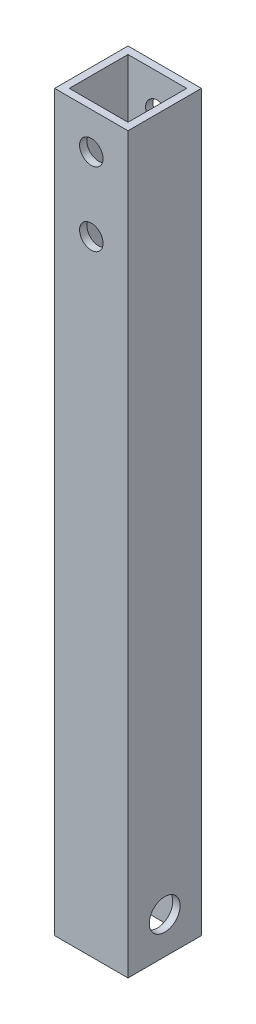
ISO-10303-21;
HEADER;
FILE_DESCRIPTION(('STEP AP214'),'2;1');
FILE_NAME('part.step','',(''),(''),'','','');
FILE_SCHEMA(('AUTOMOTIVE_DESIGN { 1 0 10303 214 1 1 1 1 }'));
ENDSEC;
DATA;
#1=APPLICATION_CONTEXT('core data for automotive mechanical design processes');
#2=APPLICATION_PROTOCOL_DEFINITION('international standard','automotive_design',2000,#1);
#3=PRODUCT_CONTEXT('',#1,'mechanical');
#4=PRODUCT('Part','Part','',(#3));
#5=PRODUCT_RELATED_PRODUCT_CATEGORY('part','',(#4));
#6=PRODUCT_DEFINITION_FORMATION('','',#4);
#7=PRODUCT_DEFINITION_CONTEXT('part definition',#1,'design');
#8=PRODUCT_DEFINITION('design','',#6,#7);
#9=PRODUCT_DEFINITION_SHAPE('','',#8);
#10=(LENGTH_UNIT() NAMED_UNIT(*) SI_UNIT(.MILLI.,.METRE.));
#11=(NAMED_UNIT(*) PLANE_ANGLE_UNIT() SI_UNIT($,.RADIAN.));
#12=(NAMED_UNIT(*) SI_UNIT($,.STERADIAN.) SOLID_ANGLE_UNIT());
#13=UNCERTAINTY_MEASURE_WITH_UNIT(LENGTH_MEASURE(1.E-05),#10,'distance_accuracy_value','');
#14=(GEOMETRIC_REPRESENTATION_CONTEXT(3) GLOBAL_UNCERTAINTY_ASSIGNED_CONTEXT((#13)) GLOBAL_UNIT_ASSIGNED_CONTEXT((#10,
#11,#12)) REPRESENTATION_CONTEXT('',''));
#15=CARTESIAN_POINT('',(0.,0.,0.));
#16=DIRECTION('',(0.,0.,1.));
#17=DIRECTION('',(1.,0.,0.));
#18=AXIS2_PLACEMENT_3D('',#15,#16,#17);
#19=CARTESIAN_POINT('',(0.,100.,0.));
#20=DIRECTION('',(0.,1.,0.));
#21=DIRECTION('',(0.,0.,1.));
#22=AXIS2_PLACEMENT_3D('',#19,#20,#21);
#23=PLANE('',#22);
#24=DIRECTION('',(0.,0.,-1.));
#25=VECTOR('',#24,1.);
#26=CARTESIAN_POINT('',(5.,100.,-5.));
#27=LINE('',#26,#25);
#28=CARTESIAN_POINT('',(5.,100.,5.));
#29=VERTEX_POINT('',#28);
#30=CARTESIAN_POINT('',(5.,100.,-5.));
#31=VERTEX_POINT('',#30);
#32=EDGE_CURVE('E164',#29,#31,#27,.T.);
#33=ORIENTED_EDGE('',*,*,#32,.T.);
#34=DIRECTION('',(-1.,0.,0.));
#35=VECTOR('',#34,1.);
#36=CARTESIAN_POINT('',(-5.,100.,-5.));
#37=LINE('',#36,#35);
#38=CARTESIAN_POINT('',(-5.,100.,-5.));
#39=VERTEX_POINT('',#38);
#40=EDGE_CURVE('E167',#31,#39,#37,.T.);
#41=ORIENTED_EDGE('',*,*,#40,.T.);
#42=DIRECTION('',(0.,0.,1.));
#43=VECTOR('',#42,1.);
#44=CARTESIAN_POINT('',(-5.,100.,-5.));
#45=LINE('',#44,#43);
#46=CARTESIAN_POINT('',(-5.,100.,5.));
#47=VERTEX_POINT('',#46);
#48=EDGE_CURVE('E170',#39,#47,#45,.T.);
#49=ORIENTED_EDGE('',*,*,#48,.T.);
#50=DIRECTION('',(1.,0.,0.));
#51=VECTOR('',#50,1.);
#52=CARTESIAN_POINT('',(-5.,100.,5.));
#53=LINE('',#52,#51);
#54=EDGE_CURVE('E172',#47,#29,#53,.T.);
#55=ORIENTED_EDGE('',*,*,#54,.T.);
#56=EDGE_LOOP('',(#33,#41,#49,#55));
#57=FACE_BOUND('',#56,.T.);
#58=DIRECTION('',(-1.,0.,0.));
#59=VECTOR('',#58,1.);
#60=CARTESIAN_POINT('',(-5.,100.,-4.));
#61=LINE('',#60,#59);
#62=CARTESIAN_POINT('',(4.,100.,-4.));
#63=VERTEX_POINT('',#62);
#64=CARTESIAN_POINT('',(-4.,100.,-4.));
#65=VERTEX_POINT('',#64);
#66=EDGE_CURVE('E134',#63,#65,#61,.T.);
#67=ORIENTED_EDGE('',*,*,#66,.F.);
#68=DIRECTION('',(0.,0.,-1.));
#69=VECTOR('',#68,1.);
#70=CARTESIAN_POINT('',(4.,100.,-5.));
#71=LINE('',#70,#69);
#72=CARTESIAN_POINT('',(4.,100.,4.));
#73=VERTEX_POINT('',#72);
#74=EDGE_CURVE('E126',#73,#63,#71,.T.);
#75=ORIENTED_EDGE('',*,*,#74,.F.);
#76=DIRECTION('',(1.,0.,0.));
#77=VECTOR('',#76,1.);
#78=CARTESIAN_POINT('',(-5.,100.,4.));
#79=LINE('',#78,#77);
#80=CARTESIAN_POINT('',(-4.,100.,4.));
#81=VERTEX_POINT('',#80);
#82=EDGE_CURVE('E148',#81,#73,#79,.T.);
#83=ORIENTED_EDGE('',*,*,#82,.F.);
#84=DIRECTION('',(0.,0.,1.));
#85=VECTOR('',#84,1.);
#86=CARTESIAN_POINT('',(-4.,100.,-5.));
#87=LINE('',#86,#85);
#88=EDGE_CURVE('E146',#65,#81,#87,.T.);
#89=ORIENTED_EDGE('',*,*,#88,.F.);
#90=EDGE_LOOP('',(#67,#75,#83,#89));
#91=FACE_BOUND('',#90,.T.);
#92=ADVANCED_FACE('F59',(#57,#91),#23,.T.);
#93=CARTESIAN_POINT('',(0.,0.,0.));
#94=DIRECTION('',(0.,1.,0.));
#95=DIRECTION('',(0.,0.,1.));
#96=AXIS2_PLACEMENT_3D('',#93,#94,#95);
#97=PLANE('',#96);
#98=DIRECTION('',(0.,0.,-1.));
#99=VECTOR('',#98,1.);
#100=CARTESIAN_POINT('',(5.,0.,-5.));
#101=LINE('',#100,#99);
#102=CARTESIAN_POINT('',(5.,0.,5.));
#103=VERTEX_POINT('',#102);
#104=CARTESIAN_POINT('',(5.,0.,-5.));
#105=VERTEX_POINT('',#104);
#106=EDGE_CURVE('E142',#103,#105,#101,.T.);
#107=ORIENTED_EDGE('',*,*,#106,.F.);
#108=DIRECTION('',(1.,0.,0.));
#109=VECTOR('',#108,1.);
#110=CARTESIAN_POINT('',(-5.,0.,5.));
#111=LINE('',#110,#109);
#112=CARTESIAN_POINT('',(-5.,0.,5.));
#113=VERTEX_POINT('',#112);
#114=EDGE_CURVE('E168',#113,#103,#111,.T.);
#115=ORIENTED_EDGE('',*,*,#114,.F.);
#116=DIRECTION('',(0.,0.,1.));
#117=VECTOR('',#116,1.);
#118=CARTESIAN_POINT('',(-5.,0.,-5.));
#119=LINE('',#118,#117);
#120=CARTESIAN_POINT('',(-5.,0.,-5.));
#121=VERTEX_POINT('',#120);
#122=EDGE_CURVE('E179',#121,#113,#119,.T.);
#123=ORIENTED_EDGE('',*,*,#122,.F.);
#124=DIRECTION('',(-1.,0.,0.));
#125=VECTOR('',#124,1.);
#126=CARTESIAN_POINT('',(-5.,0.,-5.));
#127=LINE('',#126,#125);
#128=EDGE_CURVE('E177',#105,#121,#127,.T.);
#129=ORIENTED_EDGE('',*,*,#128,.F.);
#130=EDGE_LOOP('',(#107,#115,#123,#129));
#131=FACE_BOUND('',#130,.T.);
#132=DIRECTION('',(0.,0.,-1.));
#133=VECTOR('',#132,1.);
#134=CARTESIAN_POINT('',(4.,0.,-5.));
#135=LINE('',#134,#133);
#136=CARTESIAN_POINT('',(4.,0.,4.));
#137=VERTEX_POINT('',#136);
#138=CARTESIAN_POINT('',(4.,0.,-4.));
#139=VERTEX_POINT('',#138);
#140=EDGE_CURVE('E84',#137,#139,#135,.T.);
#141=ORIENTED_EDGE('',*,*,#140,.T.);
#142=DIRECTION('',(-1.,0.,0.));
#143=VECTOR('',#142,1.);
#144=CARTESIAN_POINT('',(-5.,0.,-4.));
#145=LINE('',#144,#143);
#146=CARTESIAN_POINT('',(-4.,0.,-4.));
#147=VERTEX_POINT('',#146);
#148=EDGE_CURVE('E141',#139,#147,#145,.T.);
#149=ORIENTED_EDGE('',*,*,#148,.T.);
#150=DIRECTION('',(0.,0.,1.));
#151=VECTOR('',#150,1.);
#152=CARTESIAN_POINT('',(-4.,0.,-5.));
#153=LINE('',#152,#151);
#154=CARTESIAN_POINT('',(-4.,0.,4.));
#155=VERTEX_POINT('',#154);
#156=EDGE_CURVE('E156',#147,#155,#153,.T.);
#157=ORIENTED_EDGE('',*,*,#156,.T.);
#158=DIRECTION('',(1.,0.,0.));
#159=VECTOR('',#158,1.);
#160=CARTESIAN_POINT('',(-5.,0.,4.));
#161=LINE('',#160,#159);
#162=EDGE_CURVE('E135',#155,#137,#161,.T.);
#163=ORIENTED_EDGE('',*,*,#162,.T.);
#164=EDGE_LOOP('',(#141,#149,#157,#163));
#165=FACE_BOUND('',#164,.T.);
#166=ADVANCED_FACE('F242',(#131,#165),#97,.F.);
#167=CARTESIAN_POINT('',(5.,100.,-5.));
#168=DIRECTION('',(-1.,0.,0.));
#169=DIRECTION('',(0.,0.,1.));
#170=AXIS2_PLACEMENT_3D('',#167,#168,#169);
#171=PLANE('',#170);
#172=CARTESIAN_POINT('',(5.,5.,0.));
#173=DIRECTION('',(1.,0.,0.));
#174=DIRECTION('',(0.,0.,-1.));
#175=AXIS2_PLACEMENT_3D('',#172,#173,#174);
#176=CIRCLE('',#175,2.1);
#177=CARTESIAN_POINT('',(5.,5.,-2.1));
#178=VERTEX_POINT('',#177);
#179=EDGE_CURVE('E217',#178,#178,#176,.T.);
#180=ORIENTED_EDGE('',*,*,#179,.F.);
#181=EDGE_LOOP('',(#180));
#182=FACE_BOUND('',#181,.T.);
#183=ORIENTED_EDGE('',*,*,#106,.T.);
#184=DIRECTION('',(0.,-1.,0.));
#185=VECTOR('',#184,1.);
#186=CARTESIAN_POINT('',(5.,100.,-5.));
#187=LINE('',#186,#185);
#188=EDGE_CURVE('E12',#31,#105,#187,.T.);
#189=ORIENTED_EDGE('',*,*,#188,.F.);
#190=ORIENTED_EDGE('',*,*,#32,.F.);
#191=DIRECTION('',(0.,-1.,0.));
#192=VECTOR('',#191,1.);
#193=CARTESIAN_POINT('',(5.,100.,5.));
#194=LINE('',#193,#192);
#195=EDGE_CURVE('E174',#29,#103,#194,.T.);
#196=ORIENTED_EDGE('',*,*,#195,.T.);
#197=EDGE_LOOP('',(#183,#189,#190,#196));
#198=FACE_BOUND('',#197,.T.);
#199=ADVANCED_FACE('F61',(#182,#198),#171,.F.);
#200=CARTESIAN_POINT('',(-5.,100.,-5.));
#201=DIRECTION('',(0.,0.,1.));
#202=DIRECTION('',(1.,0.,0.));
#203=AXIS2_PLACEMENT_3D('',#200,#201,#202);
#204=PLANE('',#203);
#205=CARTESIAN_POINT('',(0.,85.,-5.));
#206=DIRECTION('',(0.,0.,1.));
#207=DIRECTION('',(1.,0.,0.));
#208=AXIS2_PLACEMENT_3D('',#205,#206,#207);
#209=CIRCLE('',#208,1.6);
#210=CARTESIAN_POINT('',(1.6,85.,-5.));
#211=VERTEX_POINT('',#210);
#212=EDGE_CURVE('E195',#211,#211,#209,.T.);
#213=ORIENTED_EDGE('',*,*,#212,.T.);
#214=EDGE_LOOP('',(#213));
#215=FACE_BOUND('',#214,.T.);
#216=CARTESIAN_POINT('',(0.,95.,-5.));
#217=DIRECTION('',(0.,0.,1.));
#218=DIRECTION('',(1.,0.,0.));
#219=AXIS2_PLACEMENT_3D('',#216,#217,#218);
#220=CIRCLE('',#219,1.6);
#221=CARTESIAN_POINT('',(1.6,95.,-5.));
#222=VERTEX_POINT('',#221);
#223=EDGE_CURVE('E206',#222,#222,#220,.T.);
#224=ORIENTED_EDGE('',*,*,#223,.T.);
#225=EDGE_LOOP('',(#224));
#226=FACE_BOUND('',#225,.T.);
#227=ORIENTED_EDGE('',*,*,#128,.T.);
#228=DIRECTION('',(0.,-1.,0.));
#229=VECTOR('',#228,1.);
#230=CARTESIAN_POINT('',(-5.,100.,-5.));
#231=LINE('',#230,#229);
#232=EDGE_CURVE('E68',#39,#121,#231,.T.);
#233=ORIENTED_EDGE('',*,*,#232,.F.);
#234=ORIENTED_EDGE('',*,*,#40,.F.);
#235=ORIENTED_EDGE('',*,*,#188,.T.);
#236=EDGE_LOOP('',(#227,#233,#234,#235));
#237=FACE_BOUND('',#236,.T.);
#238=ADVANCED_FACE('F251',(#215,#226,#237),#204,.F.);
#239=CARTESIAN_POINT('',(-5.,100.,-5.));
#240=DIRECTION('',(1.,0.,0.));
#241=DIRECTION('',(0.,0.,-1.));
#242=AXIS2_PLACEMENT_3D('',#239,#240,#241);
#243=PLANE('',#242);
#244=CARTESIAN_POINT('',(-5.,5.,0.));
#245=DIRECTION('',(1.,0.,0.));
#246=DIRECTION('',(0.,0.,-1.));
#247=AXIS2_PLACEMENT_3D('',#244,#245,#246);
#248=CIRCLE('',#247,2.1);
#249=CARTESIAN_POINT('',(-5.,5.,-2.1));
#250=VERTEX_POINT('',#249);
#251=EDGE_CURVE('E191',#250,#250,#248,.T.);
#252=ORIENTED_EDGE('',*,*,#251,.T.);
#253=EDGE_LOOP('',(#252));
#254=FACE_BOUND('',#253,.T.);
#255=ORIENTED_EDGE('',*,*,#122,.T.);
#256=DIRECTION('',(0.,-1.,0.));
#257=VECTOR('',#256,1.);
#258=CARTESIAN_POINT('',(-5.,100.,5.));
#259=LINE('',#258,#257);
#260=EDGE_CURVE('E184',#47,#113,#259,.T.);
#261=ORIENTED_EDGE('',*,*,#260,.F.);
#262=ORIENTED_EDGE('',*,*,#48,.F.);
#263=ORIENTED_EDGE('',*,*,#232,.T.);
#264=EDGE_LOOP('',(#255,#261,#262,#263));
#265=FACE_BOUND('',#264,.T.);
#266=ADVANCED_FACE('F237',(#254,#265),#243,.F.);
#267=CARTESIAN_POINT('',(-5.,100.,5.));
#268=DIRECTION('',(0.,0.,-1.));
#269=DIRECTION('',(-1.,0.,0.));
#270=AXIS2_PLACEMENT_3D('',#267,#268,#269);
#271=PLANE('',#270);
#272=CARTESIAN_POINT('',(0.,85.,5.));
#273=DIRECTION('',(0.,0.,1.));
#274=DIRECTION('',(1.,0.,0.));
#275=AXIS2_PLACEMENT_3D('',#272,#273,#274);
#276=CIRCLE('',#275,1.6);
#277=CARTESIAN_POINT('',(1.6,85.,5.));
#278=VERTEX_POINT('',#277);
#279=EDGE_CURVE('E201',#278,#278,#276,.T.);
#280=ORIENTED_EDGE('',*,*,#279,.F.);
#281=EDGE_LOOP('',(#280));
#282=FACE_BOUND('',#281,.T.);
#283=CARTESIAN_POINT('',(0.,95.,5.));
#284=DIRECTION('',(0.,0.,1.));
#285=DIRECTION('',(1.,0.,0.));
#286=AXIS2_PLACEMENT_3D('',#283,#284,#285);
#287=CIRCLE('',#286,1.6);
#288=CARTESIAN_POINT('',(1.6,95.,5.));
#289=VERTEX_POINT('',#288);
#290=EDGE_CURVE('E211',#289,#289,#287,.T.);
#291=ORIENTED_EDGE('',*,*,#290,.F.);
#292=EDGE_LOOP('',(#291));
#293=FACE_BOUND('',#292,.T.);
#294=ORIENTED_EDGE('',*,*,#114,.T.);
#295=ORIENTED_EDGE('',*,*,#195,.F.);
#296=ORIENTED_EDGE('',*,*,#54,.F.);
#297=ORIENTED_EDGE('',*,*,#260,.T.);
#298=EDGE_LOOP('',(#294,#295,#296,#297));
#299=FACE_BOUND('',#298,.T.);
#300=ADVANCED_FACE('F228',(#282,#293,#299),#271,.F.);
#301=CARTESIAN_POINT('',(4.,100.,-5.));
#302=DIRECTION('',(-1.,0.,0.));
#303=DIRECTION('',(0.,0.,1.));
#304=AXIS2_PLACEMENT_3D('',#301,#302,#303);
#305=PLANE('',#304);
#306=CARTESIAN_POINT('',(4.,5.,0.));
#307=DIRECTION('',(-1.,0.,0.));
#308=DIRECTION('',(0.,0.,1.));
#309=AXIS2_PLACEMENT_3D('',#306,#307,#308);
#310=CIRCLE('',#309,2.1);
#311=CARTESIAN_POINT('',(4.,5.,2.1));
#312=VERTEX_POINT('',#311);
#313=EDGE_CURVE('E154',#312,#312,#310,.T.);
#314=ORIENTED_EDGE('',*,*,#313,.F.);
#315=EDGE_LOOP('',(#314));
#316=FACE_BOUND('',#315,.T.);
#317=ORIENTED_EDGE('',*,*,#140,.F.);
#318=DIRECTION('',(0.,-1.,0.));
#319=VECTOR('',#318,1.);
#320=CARTESIAN_POINT('',(4.,100.,4.));
#321=LINE('',#320,#319);
#322=EDGE_CURVE('E130',#73,#137,#321,.T.);
#323=ORIENTED_EDGE('',*,*,#322,.F.);
#324=ORIENTED_EDGE('',*,*,#74,.T.);
#325=DIRECTION('',(0.,-1.,0.));
#326=VECTOR('',#325,1.);
#327=CARTESIAN_POINT('',(4.,100.,-4.));
#328=LINE('',#327,#326);
#329=EDGE_CURVE('E129',#63,#139,#328,.T.);
#330=ORIENTED_EDGE('',*,*,#329,.T.);
#331=EDGE_LOOP('',(#317,#323,#324,#330));
#332=FACE_BOUND('',#331,.T.);
#333=ADVANCED_FACE('F128',(#316,#332),#305,.T.);
#334=CARTESIAN_POINT('',(-5.,100.,-4.));
#335=DIRECTION('',(0.,0.,1.));
#336=DIRECTION('',(1.,0.,0.));
#337=AXIS2_PLACEMENT_3D('',#334,#335,#336);
#338=PLANE('',#337);
#339=CARTESIAN_POINT('',(0.,85.,-4.));
#340=DIRECTION('',(0.,0.,1.));
#341=DIRECTION('',(1.,0.,0.));
#342=AXIS2_PLACEMENT_3D('',#339,#340,#341);
#343=CIRCLE('',#342,1.6);
#344=CARTESIAN_POINT('',(1.6,85.,-4.));
#345=VERTEX_POINT('',#344);
#346=EDGE_CURVE('E214',#345,#345,#343,.T.);
#347=ORIENTED_EDGE('',*,*,#346,.F.);
#348=EDGE_LOOP('',(#347));
#349=FACE_BOUND('',#348,.T.);
#350=CARTESIAN_POINT('',(0.,95.,-4.));
#351=DIRECTION('',(0.,0.,1.));
#352=DIRECTION('',(1.,0.,0.));
#353=AXIS2_PLACEMENT_3D('',#350,#351,#352);
#354=CIRCLE('',#353,1.6);
#355=CARTESIAN_POINT('',(1.6,95.,-4.));
#356=VERTEX_POINT('',#355);
#357=EDGE_CURVE('E194',#356,#356,#354,.T.);
#358=ORIENTED_EDGE('',*,*,#357,.F.);
#359=EDGE_LOOP('',(#358));
#360=FACE_BOUND('',#359,.T.);
#361=ORIENTED_EDGE('',*,*,#148,.F.);
#362=ORIENTED_EDGE('',*,*,#329,.F.);
#363=ORIENTED_EDGE('',*,*,#66,.T.);
#364=DIRECTION('',(0.,-1.,0.));
#365=VECTOR('',#364,1.);
#366=CARTESIAN_POINT('',(-4.,100.,-4.));
#367=LINE('',#366,#365);
#368=EDGE_CURVE('E143',#65,#147,#367,.T.);
#369=ORIENTED_EDGE('',*,*,#368,.T.);
#370=EDGE_LOOP('',(#361,#362,#363,#369));
#371=FACE_BOUND('',#370,.T.);
#372=ADVANCED_FACE('F138',(#349,#360,#371),#338,.T.);
#373=CARTESIAN_POINT('',(-4.,100.,-5.));
#374=DIRECTION('',(1.,0.,0.));
#375=DIRECTION('',(0.,0.,-1.));
#376=AXIS2_PLACEMENT_3D('',#373,#374,#375);
#377=PLANE('',#376);
#378=CARTESIAN_POINT('',(-4.,5.,0.));
#379=DIRECTION('',(1.,0.,0.));
#380=DIRECTION('',(0.,0.,-1.));
#381=AXIS2_PLACEMENT_3D('',#378,#379,#380);
#382=CIRCLE('',#381,2.1);
#383=CARTESIAN_POINT('',(-4.,5.,-2.1));
#384=VERTEX_POINT('',#383);
#385=EDGE_CURVE('E189',#384,#384,#382,.T.);
#386=ORIENTED_EDGE('',*,*,#385,.F.);
#387=EDGE_LOOP('',(#386));
#388=FACE_BOUND('',#387,.T.);
#389=ORIENTED_EDGE('',*,*,#156,.F.);
#390=ORIENTED_EDGE('',*,*,#368,.F.);
#391=ORIENTED_EDGE('',*,*,#88,.T.);
#392=DIRECTION('',(0.,-1.,0.));
#393=VECTOR('',#392,1.);
#394=CARTESIAN_POINT('',(-4.,100.,4.));
#395=LINE('',#394,#393);
#396=EDGE_CURVE('E76',#81,#155,#395,.T.);
#397=ORIENTED_EDGE('',*,*,#396,.T.);
#398=EDGE_LOOP('',(#389,#390,#391,#397));
#399=FACE_BOUND('',#398,.T.);
#400=ADVANCED_FACE('F234',(#388,#399),#377,.T.);
#401=CARTESIAN_POINT('',(-5.,100.,4.));
#402=DIRECTION('',(0.,0.,-1.));
#403=DIRECTION('',(-1.,0.,0.));
#404=AXIS2_PLACEMENT_3D('',#401,#402,#403);
#405=PLANE('',#404);
#406=CARTESIAN_POINT('',(0.,85.,4.));
#407=DIRECTION('',(0.,0.,-1.));
#408=DIRECTION('',(-1.,0.,0.));
#409=AXIS2_PLACEMENT_3D('',#406,#407,#408);
#410=CIRCLE('',#409,1.6);
#411=CARTESIAN_POINT('',(-1.6,85.,4.));
#412=VERTEX_POINT('',#411);
#413=EDGE_CURVE('E63',#412,#412,#410,.T.);
#414=ORIENTED_EDGE('',*,*,#413,.F.);
#415=EDGE_LOOP('',(#414));
#416=FACE_BOUND('',#415,.T.);
#417=CARTESIAN_POINT('',(0.,95.,4.));
#418=DIRECTION('',(0.,0.,-1.));
#419=DIRECTION('',(-1.,0.,0.));
#420=AXIS2_PLACEMENT_3D('',#417,#418,#419);
#421=CIRCLE('',#420,1.6);
#422=CARTESIAN_POINT('',(-1.6,95.,4.));
#423=VERTEX_POINT('',#422);
#424=EDGE_CURVE('E192',#423,#423,#421,.T.);
#425=ORIENTED_EDGE('',*,*,#424,.F.);
#426=EDGE_LOOP('',(#425));
#427=FACE_BOUND('',#426,.T.);
#428=ORIENTED_EDGE('',*,*,#162,.F.);
#429=ORIENTED_EDGE('',*,*,#396,.F.);
#430=ORIENTED_EDGE('',*,*,#82,.T.);
#431=ORIENTED_EDGE('',*,*,#322,.T.);
#432=EDGE_LOOP('',(#428,#429,#430,#431));
#433=FACE_BOUND('',#432,.T.);
#434=ADVANCED_FACE('F276',(#416,#427,#433),#405,.T.);
#435=CARTESIAN_POINT('',(-5.,5.,0.));
#436=DIRECTION('',(1.,0.,0.));
#437=DIRECTION('',(0.,0.,-1.));
#438=AXIS2_PLACEMENT_3D('',#435,#436,#437);
#439=CYLINDRICAL_SURFACE('',#438,2.1);
#440=ORIENTED_EDGE('',*,*,#385,.T.);
#441=EDGE_LOOP('',(#440));
#442=FACE_BOUND('',#441,.T.);
#443=ORIENTED_EDGE('',*,*,#251,.F.);
#444=EDGE_LOOP('',(#443));
#445=FACE_BOUND('',#444,.T.);
#446=ADVANCED_FACE('F278',(#442,#445),#439,.F.);
#447=ORIENTED_EDGE('',*,*,#313,.T.);
#448=EDGE_LOOP('',(#447));
#449=FACE_BOUND('',#448,.T.);
#450=ORIENTED_EDGE('',*,*,#179,.T.);
#451=EDGE_LOOP('',(#450));
#452=FACE_BOUND('',#451,.T.);
#453=ADVANCED_FACE('F224',(#449,#452),#439,.F.);
#454=CARTESIAN_POINT('',(0.,95.,-5.));
#455=DIRECTION('',(0.,0.,1.));
#456=DIRECTION('',(1.,0.,0.));
#457=AXIS2_PLACEMENT_3D('',#454,#455,#456);
#458=CYLINDRICAL_SURFACE('',#457,1.6);
#459=ORIENTED_EDGE('',*,*,#424,.T.);
#460=EDGE_LOOP('',(#459));
#461=FACE_BOUND('',#460,.T.);
#462=ORIENTED_EDGE('',*,*,#290,.T.);
#463=EDGE_LOOP('',(#462));
#464=FACE_BOUND('',#463,.T.);
#465=ADVANCED_FACE('F292',(#461,#464),#458,.F.);
#466=CARTESIAN_POINT('',(0.,85.,-5.));
#467=DIRECTION('',(0.,0.,1.));
#468=DIRECTION('',(1.,0.,0.));
#469=AXIS2_PLACEMENT_3D('',#466,#467,#468);
#470=CYLINDRICAL_SURFACE('',#469,1.6);
#471=ORIENTED_EDGE('',*,*,#413,.T.);
#472=EDGE_LOOP('',(#471));
#473=FACE_BOUND('',#472,.T.);
#474=ORIENTED_EDGE('',*,*,#279,.T.);
#475=EDGE_LOOP('',(#474));
#476=FACE_BOUND('',#475,.T.);
#477=ADVANCED_FACE('F295',(#473,#476),#470,.F.);
#478=ORIENTED_EDGE('',*,*,#357,.T.);
#479=EDGE_LOOP('',(#478));
#480=FACE_BOUND('',#479,.T.);
#481=ORIENTED_EDGE('',*,*,#223,.F.);
#482=EDGE_LOOP('',(#481));
#483=FACE_BOUND('',#482,.T.);
#484=ADVANCED_FACE('F296',(#480,#483),#458,.F.);
#485=ORIENTED_EDGE('',*,*,#346,.T.);
#486=EDGE_LOOP('',(#485));
#487=FACE_BOUND('',#486,.T.);
#488=ORIENTED_EDGE('',*,*,#212,.F.);
#489=EDGE_LOOP('',(#488));
#490=FACE_BOUND('',#489,.T.);
#491=ADVANCED_FACE('F299',(#487,#490),#470,.F.);
#492=CLOSED_SHELL('',(#92,#166,#199,#238,#266,#300,#333,#372,#400,#434,#446,#453,#465,#477,#484,#491));
#493=MANIFOLD_SOLID_BREP('B2',#492);
#494=ADVANCED_BREP_SHAPE_REPRESENTATION('',(#18,#493),#14);
#495=SHAPE_DEFINITION_REPRESENTATION(#9,#494);
ENDSEC;
END-ISO-10303-21;
